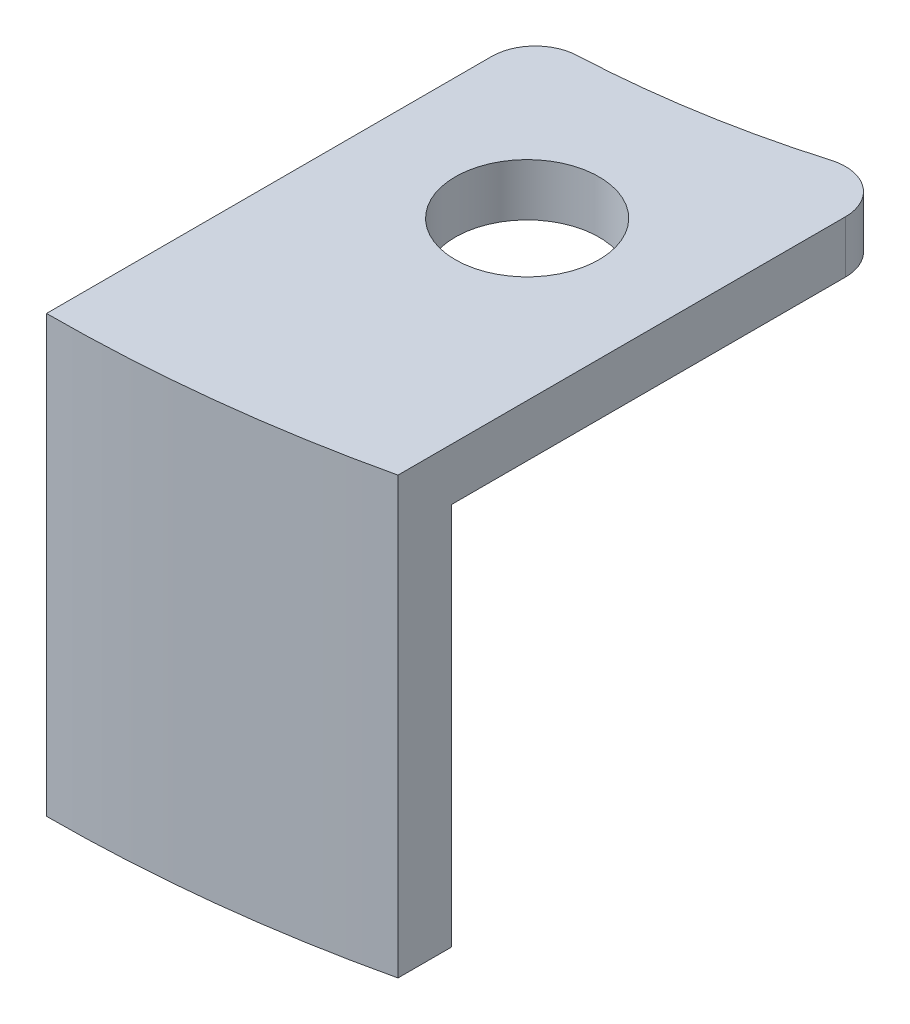
ISO-10303-21;
HEADER;
FILE_DESCRIPTION(('STEP AP214'),'2;1');
FILE_NAME('part.step','',(''),(''),'','','');
FILE_SCHEMA(('AUTOMOTIVE_DESIGN { 1 0 10303 214 1 1 1 1 }'));
ENDSEC;
DATA;
#1=APPLICATION_CONTEXT('core data for automotive mechanical design processes');
#2=APPLICATION_PROTOCOL_DEFINITION('international standard','automotive_design',2000,#1);
#3=PRODUCT_CONTEXT('',#1,'mechanical');
#4=PRODUCT('Part','Part','',(#3));
#5=PRODUCT_RELATED_PRODUCT_CATEGORY('part','',(#4));
#6=PRODUCT_DEFINITION_FORMATION('','',#4);
#7=PRODUCT_DEFINITION_CONTEXT('part definition',#1,'design');
#8=PRODUCT_DEFINITION('design','',#6,#7);
#9=PRODUCT_DEFINITION_SHAPE('','',#8);
#10=(LENGTH_UNIT() NAMED_UNIT(*) SI_UNIT(.MILLI.,.METRE.));
#11=(NAMED_UNIT(*) PLANE_ANGLE_UNIT() SI_UNIT($,.RADIAN.));
#12=(NAMED_UNIT(*) SI_UNIT($,.STERADIAN.) SOLID_ANGLE_UNIT());
#13=UNCERTAINTY_MEASURE_WITH_UNIT(LENGTH_MEASURE(1.E-05),#10,'distance_accuracy_value','');
#14=(GEOMETRIC_REPRESENTATION_CONTEXT(3) GLOBAL_UNCERTAINTY_ASSIGNED_CONTEXT((#13)) GLOBAL_UNIT_ASSIGNED_CONTEXT((#10,
#11,#12)) REPRESENTATION_CONTEXT('',''));
#15=CARTESIAN_POINT('',(0.,0.,0.));
#16=DIRECTION('',(0.,0.,1.));
#17=DIRECTION('',(1.,0.,0.));
#18=AXIS2_PLACEMENT_3D('',#15,#16,#17);
#19=CARTESIAN_POINT('',(0.,-2.4,-42.5));
#20=DIRECTION('',(0.,1.,0.));
#21=DIRECTION('',(0.,0.,1.));
#22=AXIS2_PLACEMENT_3D('',#19,#20,#21);
#23=CYLINDRICAL_SURFACE('',#22,42.5);
#24=CARTESIAN_POINT('',(0.,-2.4,-42.5));
#25=DIRECTION('',(0.,-1.,0.));
#26=DIRECTION('',(0.,0.,1.));
#27=AXIS2_PLACEMENT_3D('',#24,#25,#26);
#28=CIRCLE('',#27,42.5);
#29=CARTESIAN_POINT('',(11.938202247191,-2.4,-1.71116173381296));
#30=VERTEX_POINT('',#29);
#31=CARTESIAN_POINT('',(1.91011235955056,-2.4,-0.0429455711551743));
#32=VERTEX_POINT('',#31);
#33=EDGE_CURVE('E145',#30,#32,#28,.T.);
#34=ORIENTED_EDGE('',*,*,#33,.T.);
#35=DIRECTION('',(0.,1.,0.));
#36=VECTOR('',#35,1.);
#37=CARTESIAN_POINT('',(1.91011235955056,-2.4,-0.0429455711551674));
#38=LINE('',#37,#36);
#39=CARTESIAN_POINT('',(1.91011235955056,0.,-0.0429455711551743));
#40=VERTEX_POINT('',#39);
#41=EDGE_CURVE('E162',#32,#40,#38,.T.);
#42=ORIENTED_EDGE('',*,*,#41,.T.);
#43=CARTESIAN_POINT('',(0.,0.,-42.5));
#44=DIRECTION('',(0.,-1.,0.));
#45=DIRECTION('',(0.,0.,1.));
#46=AXIS2_PLACEMENT_3D('',#43,#44,#45);
#47=CIRCLE('',#46,42.5);
#48=CARTESIAN_POINT('',(11.938202247191,0.,-1.71116173381296));
#49=VERTEX_POINT('',#48);
#50=EDGE_CURVE('E140',#49,#40,#47,.T.);
#51=ORIENTED_EDGE('',*,*,#50,.F.);
#52=DIRECTION('',(0.,1.,0.));
#53=VECTOR('',#52,1.);
#54=CARTESIAN_POINT('',(11.938202247191,-2.4,-1.71116173381296));
#55=LINE('',#54,#53);
#56=EDGE_CURVE('E154',#49,#30,#55,.F.);
#57=ORIENTED_EDGE('',*,*,#56,.T.);
#58=EDGE_LOOP('',(#34,#42,#51,#57));
#59=FACE_BOUND('',#58,.T.);
#60=ADVANCED_FACE('F37',(#59),#23,.F.);
#61=CARTESIAN_POINT('',(14.5,-2.4,-2.55003128912364));
#62=DIRECTION('',(1.,0.,0.));
#63=DIRECTION('',(0.,0.,-1.));
#64=AXIS2_PLACEMENT_3D('',#61,#62,#63);
#65=PLANE('',#64);
#66=DIRECTION('',(0.,0.,-1.));
#67=VECTOR('',#66,1.);
#68=CARTESIAN_POINT('',(14.5,-2.4,-2.55003128912364));
#69=LINE('',#68,#67);
#70=CARTESIAN_POINT('',(14.5,-2.4,18.2947366142827));
#71=VERTEX_POINT('',#70);
#72=CARTESIAN_POINT('',(14.5,-2.4,0.208313008125252));
#73=VERTEX_POINT('',#72);
#74=EDGE_CURVE('E152',#71,#73,#69,.T.);
#75=ORIENTED_EDGE('',*,*,#74,.T.);
#76=DIRECTION('',(0.,1.,0.));
#77=VECTOR('',#76,1.);
#78=CARTESIAN_POINT('',(14.5,-2.4,0.208313008125252));
#79=LINE('',#78,#77);
#80=CARTESIAN_POINT('',(14.5,0.,0.208313008125252));
#81=VERTEX_POINT('',#80);
#82=EDGE_CURVE('E11',#73,#81,#79,.T.);
#83=ORIENTED_EDGE('',*,*,#82,.T.);
#84=DIRECTION('',(0.,0.,-1.));
#85=VECTOR('',#84,1.);
#86=CARTESIAN_POINT('',(14.5,0.,-2.55003128912364));
#87=LINE('',#86,#85);
#88=CARTESIAN_POINT('',(14.5,0.,20.7594656948666));
#89=VERTEX_POINT('',#88);
#90=EDGE_CURVE('E148',#89,#81,#87,.T.);
#91=ORIENTED_EDGE('',*,*,#90,.F.);
#92=DIRECTION('',(0.,1.,0.));
#93=VECTOR('',#92,1.);
#94=CARTESIAN_POINT('',(14.5,-20.,20.7594656948666));
#95=LINE('',#94,#93);
#96=CARTESIAN_POINT('',(14.5,-20.,20.7594656948666));
#97=VERTEX_POINT('',#96);
#98=EDGE_CURVE('E141',#97,#89,#95,.T.);
#99=ORIENTED_EDGE('',*,*,#98,.F.);
#100=DIRECTION('',(0.,0.,-1.));
#101=VECTOR('',#100,1.);
#102=CARTESIAN_POINT('',(14.5,-20.,18.2947366142827));
#103=LINE('',#102,#101);
#104=CARTESIAN_POINT('',(14.5,-20.,18.2947366142827));
#105=VERTEX_POINT('',#104);
#106=EDGE_CURVE('E114',#97,#105,#103,.T.);
#107=ORIENTED_EDGE('',*,*,#106,.T.);
#108=DIRECTION('',(0.,1.,0.));
#109=VECTOR('',#108,1.);
#110=CARTESIAN_POINT('',(14.5,-20.,18.2947366142827));
#111=LINE('',#110,#109);
#112=EDGE_CURVE('E128',#105,#71,#111,.T.);
#113=ORIENTED_EDGE('',*,*,#112,.T.);
#114=EDGE_LOOP('',(#75,#83,#91,#99,#107,#113));
#115=FACE_BOUND('',#114,.T.);
#116=ADVANCED_FACE('F184',(#115),#65,.T.);
#117=CARTESIAN_POINT('',(0.,-2.4,0.));
#118=DIRECTION('',(-1.,0.,0.));
#119=DIRECTION('',(0.,0.,1.));
#120=AXIS2_PLACEMENT_3D('',#117,#118,#119);
#121=PLANE('',#120);
#122=DIRECTION('',(0.,0.,1.));
#123=VECTOR('',#122,1.);
#124=CARTESIAN_POINT('',(0.,0.,0.));
#125=LINE('',#124,#123);
#126=CARTESIAN_POINT('',(0.,0.,1.95503346079047));
#127=VERTEX_POINT('',#126);
#128=CARTESIAN_POINT('',(0.,0.,22.4));
#129=VERTEX_POINT('',#128);
#130=EDGE_CURVE('E157',#127,#129,#125,.T.);
#131=ORIENTED_EDGE('',*,*,#130,.F.);
#132=DIRECTION('',(0.,1.,0.));
#133=VECTOR('',#132,1.);
#134=CARTESIAN_POINT('',(0.,-2.4,1.95503346079047));
#135=LINE('',#134,#133);
#136=CARTESIAN_POINT('',(0.,-2.4,1.95503346079047));
#137=VERTEX_POINT('',#136);
#138=EDGE_CURVE('E60',#127,#137,#135,.F.);
#139=ORIENTED_EDGE('',*,*,#138,.T.);
#140=DIRECTION('',(0.,0.,1.));
#141=VECTOR('',#140,1.);
#142=CARTESIAN_POINT('',(0.,-2.4,0.));
#143=LINE('',#142,#141);
#144=CARTESIAN_POINT('',(0.,-2.4,20.));
#145=VERTEX_POINT('',#144);
#146=EDGE_CURVE('E109',#137,#145,#143,.T.);
#147=ORIENTED_EDGE('',*,*,#146,.T.);
#148=DIRECTION('',(0.,1.,0.));
#149=VECTOR('',#148,1.);
#150=CARTESIAN_POINT('',(0.,-20.,20.));
#151=LINE('',#150,#149);
#152=CARTESIAN_POINT('',(0.,-20.,20.));
#153=VERTEX_POINT('',#152);
#154=EDGE_CURVE('E104',#153,#145,#151,.T.);
#155=ORIENTED_EDGE('',*,*,#154,.F.);
#156=DIRECTION('',(0.,0.,1.));
#157=VECTOR('',#156,1.);
#158=CARTESIAN_POINT('',(0.,-20.,20.));
#159=LINE('',#158,#157);
#160=CARTESIAN_POINT('',(0.,-20.,22.4));
#161=VERTEX_POINT('',#160);
#162=EDGE_CURVE('E108',#153,#161,#159,.T.);
#163=ORIENTED_EDGE('',*,*,#162,.T.);
#164=DIRECTION('',(0.,1.,0.));
#165=VECTOR('',#164,1.);
#166=CARTESIAN_POINT('',(0.,-20.,22.4));
#167=LINE('',#166,#165);
#168=EDGE_CURVE('E113',#161,#129,#167,.T.);
#169=ORIENTED_EDGE('',*,*,#168,.T.);
#170=EDGE_LOOP('',(#131,#139,#147,#155,#163,#169));
#171=FACE_BOUND('',#170,.T.);
#172=ADVANCED_FACE('F106',(#171),#121,.T.);
#173=CARTESIAN_POINT('',(0.,-2.4,-42.5));
#174=DIRECTION('',(0.,1.,0.));
#175=DIRECTION('',(0.,0.,1.));
#176=AXIS2_PLACEMENT_3D('',#173,#174,#175);
#177=PLANE('',#176);
#178=CARTESIAN_POINT('',(7.25,-2.4,7.57807584002584));
#179=DIRECTION('',(0.,1.,0.));
#180=DIRECTION('',(0.,0.,1.));
#181=AXIS2_PLACEMENT_3D('',#178,#179,#180);
#182=CIRCLE('',#181,3.3);
#183=CARTESIAN_POINT('',(7.25,-2.4,10.8780758400258));
#184=VERTEX_POINT('',#183);
#185=EDGE_CURVE('E132',#184,#184,#182,.T.);
#186=ORIENTED_EDGE('',*,*,#185,.T.);
#187=EDGE_LOOP('',(#186));
#188=FACE_BOUND('',#187,.T.);
#189=ORIENTED_EDGE('',*,*,#146,.F.);
#190=CARTESIAN_POINT('',(2.,-2.4,1.95503346079047));
#191=DIRECTION('',(0.,1.,0.));
#192=DIRECTION('',(0.,0.,1.));
#193=AXIS2_PLACEMENT_3D('',#190,#191,#192);
#194=CIRCLE('',#193,2.);
#195=EDGE_CURVE('E45',#137,#32,#194,.F.);
#196=ORIENTED_EDGE('',*,*,#195,.T.);
#197=ORIENTED_EDGE('',*,*,#33,.F.);
#198=CARTESIAN_POINT('',(12.5,-2.4,0.208313008125252));
#199=DIRECTION('',(0.,1.,0.));
#200=DIRECTION('',(0.,0.,1.));
#201=AXIS2_PLACEMENT_3D('',#198,#199,#200);
#202=CIRCLE('',#201,2.);
#203=EDGE_CURVE('E52',#30,#73,#202,.F.);
#204=ORIENTED_EDGE('',*,*,#203,.T.);
#205=ORIENTED_EDGE('',*,*,#74,.F.);
#206=CARTESIAN_POINT('',(0.,-2.4,-42.5));
#207=DIRECTION('',(0.,1.,0.));
#208=DIRECTION('',(0.,0.,1.));
#209=AXIS2_PLACEMENT_3D('',#206,#207,#208);
#210=CIRCLE('',#209,62.5);
#211=EDGE_CURVE('E150',#145,#71,#210,.T.);
#212=ORIENTED_EDGE('',*,*,#211,.F.);
#213=EDGE_LOOP('',(#189,#196,#197,#204,#205,#212));
#214=FACE_BOUND('',#213,.T.);
#215=ADVANCED_FACE('F171',(#188,#214),#177,.F.);
#216=CARTESIAN_POINT('',(0.,0.,-42.5));
#217=DIRECTION('',(0.,1.,0.));
#218=DIRECTION('',(0.,0.,1.));
#219=AXIS2_PLACEMENT_3D('',#216,#217,#218);
#220=PLANE('',#219);
#221=CARTESIAN_POINT('',(7.25,0.,7.57807584002584));
#222=DIRECTION('',(0.,1.,0.));
#223=DIRECTION('',(0.,0.,1.));
#224=AXIS2_PLACEMENT_3D('',#221,#222,#223);
#225=CIRCLE('',#224,3.3);
#226=CARTESIAN_POINT('',(7.25,0.,10.8780758400258));
#227=VERTEX_POINT('',#226);
#228=EDGE_CURVE('E311',#227,#227,#225,.T.);
#229=ORIENTED_EDGE('',*,*,#228,.F.);
#230=EDGE_LOOP('',(#229));
#231=FACE_BOUND('',#230,.T.);
#232=ORIENTED_EDGE('',*,*,#50,.T.);
#233=CARTESIAN_POINT('',(2.,0.,1.95503346079047));
#234=DIRECTION('',(0.,1.,0.));
#235=DIRECTION('',(0.,0.,1.));
#236=AXIS2_PLACEMENT_3D('',#233,#234,#235);
#237=CIRCLE('',#236,2.);
#238=EDGE_CURVE('E167',#40,#127,#237,.T.);
#239=ORIENTED_EDGE('',*,*,#238,.T.);
#240=ORIENTED_EDGE('',*,*,#130,.T.);
#241=CARTESIAN_POINT('',(0.,0.,-42.5));
#242=DIRECTION('',(0.,1.,0.));
#243=DIRECTION('',(0.,0.,1.));
#244=AXIS2_PLACEMENT_3D('',#241,#242,#243);
#245=CIRCLE('',#244,64.9);
#246=EDGE_CURVE('E129',#129,#89,#245,.T.);
#247=ORIENTED_EDGE('',*,*,#246,.T.);
#248=ORIENTED_EDGE('',*,*,#90,.T.);
#249=CARTESIAN_POINT('',(12.5,0.,0.208313008125252));
#250=DIRECTION('',(0.,1.,0.));
#251=DIRECTION('',(0.,0.,1.));
#252=AXIS2_PLACEMENT_3D('',#249,#250,#251);
#253=CIRCLE('',#252,2.);
#254=EDGE_CURVE('E165',#81,#49,#253,.T.);
#255=ORIENTED_EDGE('',*,*,#254,.T.);
#256=EDGE_LOOP('',(#232,#239,#240,#247,#248,#255));
#257=FACE_BOUND('',#256,.T.);
#258=ADVANCED_FACE('F179',(#231,#257),#220,.T.);
#259=CARTESIAN_POINT('',(0.,-20.,-42.5));
#260=DIRECTION('',(0.,1.,0.));
#261=DIRECTION('',(0.,0.,1.));
#262=AXIS2_PLACEMENT_3D('',#259,#260,#261);
#263=CYLINDRICAL_SURFACE('',#262,62.5);
#264=ORIENTED_EDGE('',*,*,#211,.T.);
#265=ORIENTED_EDGE('',*,*,#112,.F.);
#266=CARTESIAN_POINT('',(0.,-20.,-42.5));
#267=DIRECTION('',(0.,-1.,0.));
#268=DIRECTION('',(0.,0.,1.));
#269=AXIS2_PLACEMENT_3D('',#266,#267,#268);
#270=CIRCLE('',#269,62.5);
#271=EDGE_CURVE('E121',#105,#153,#270,.T.);
#272=ORIENTED_EDGE('',*,*,#271,.T.);
#273=ORIENTED_EDGE('',*,*,#154,.T.);
#274=EDGE_LOOP('',(#264,#265,#272,#273));
#275=FACE_BOUND('',#274,.T.);
#276=ADVANCED_FACE('F126',(#275),#263,.F.);
#277=CARTESIAN_POINT('',(0.,-20.,-42.5));
#278=DIRECTION('',(0.,1.,0.));
#279=DIRECTION('',(0.,0.,1.));
#280=AXIS2_PLACEMENT_3D('',#277,#278,#279);
#281=CYLINDRICAL_SURFACE('',#280,64.9);
#282=ORIENTED_EDGE('',*,*,#246,.F.);
#283=ORIENTED_EDGE('',*,*,#168,.F.);
#284=CARTESIAN_POINT('',(0.,-20.,-42.5));
#285=DIRECTION('',(0.,1.,0.));
#286=DIRECTION('',(0.,0.,1.));
#287=AXIS2_PLACEMENT_3D('',#284,#285,#286);
#288=CIRCLE('',#287,64.9);
#289=EDGE_CURVE('E124',#161,#97,#288,.T.);
#290=ORIENTED_EDGE('',*,*,#289,.T.);
#291=ORIENTED_EDGE('',*,*,#98,.T.);
#292=EDGE_LOOP('',(#282,#283,#290,#291));
#293=FACE_BOUND('',#292,.T.);
#294=ADVANCED_FACE('F182',(#293),#281,.T.);
#295=CARTESIAN_POINT('',(0.,-20.,-42.5));
#296=DIRECTION('',(0.,1.,0.));
#297=DIRECTION('',(0.,0.,1.));
#298=AXIS2_PLACEMENT_3D('',#295,#296,#297);
#299=PLANE('',#298);
#300=ORIENTED_EDGE('',*,*,#271,.F.);
#301=ORIENTED_EDGE('',*,*,#106,.F.);
#302=ORIENTED_EDGE('',*,*,#289,.F.);
#303=ORIENTED_EDGE('',*,*,#162,.F.);
#304=EDGE_LOOP('',(#300,#301,#302,#303));
#305=FACE_BOUND('',#304,.T.);
#306=ADVANCED_FACE('F119',(#305),#299,.F.);
#307=CARTESIAN_POINT('',(2.,-2.4,1.95503346079047));
#308=DIRECTION('',(0.,1.,0.));
#309=DIRECTION('',(0.,0.,1.));
#310=AXIS2_PLACEMENT_3D('',#307,#308,#309);
#311=CYLINDRICAL_SURFACE('',#310,2.);
#312=ORIENTED_EDGE('',*,*,#195,.F.);
#313=ORIENTED_EDGE('',*,*,#138,.F.);
#314=ORIENTED_EDGE('',*,*,#238,.F.);
#315=ORIENTED_EDGE('',*,*,#41,.F.);
#316=EDGE_LOOP('',(#312,#313,#314,#315));
#317=FACE_BOUND('',#316,.T.);
#318=ADVANCED_FACE('F177',(#317),#311,.T.);
#319=CARTESIAN_POINT('',(12.5,-2.4,0.208313008125252));
#320=DIRECTION('',(0.,1.,0.));
#321=DIRECTION('',(0.,0.,1.));
#322=AXIS2_PLACEMENT_3D('',#319,#320,#321);
#323=CYLINDRICAL_SURFACE('',#322,2.);
#324=ORIENTED_EDGE('',*,*,#203,.F.);
#325=ORIENTED_EDGE('',*,*,#56,.F.);
#326=ORIENTED_EDGE('',*,*,#254,.F.);
#327=ORIENTED_EDGE('',*,*,#82,.F.);
#328=EDGE_LOOP('',(#324,#325,#326,#327));
#329=FACE_BOUND('',#328,.T.);
#330=ADVANCED_FACE('F39',(#329),#323,.T.);
#331=CARTESIAN_POINT('',(7.25,-20.,7.57807584002584));
#332=DIRECTION('',(0.,1.,0.));
#333=DIRECTION('',(0.,0.,1.));
#334=AXIS2_PLACEMENT_3D('',#331,#332,#333);
#335=CYLINDRICAL_SURFACE('',#334,3.3);
#336=ORIENTED_EDGE('',*,*,#228,.T.);
#337=EDGE_LOOP('',(#336));
#338=FACE_BOUND('',#337,.T.);
#339=ORIENTED_EDGE('',*,*,#185,.F.);
#340=EDGE_LOOP('',(#339));
#341=FACE_BOUND('',#340,.T.);
#342=ADVANCED_FACE('F188',(#338,#341),#335,.F.);
#343=CLOSED_SHELL('',(#60,#116,#172,#215,#258,#276,#294,#306,#318,#330,#342));
#344=MANIFOLD_SOLID_BREP('B2',#343);
#345=ADVANCED_BREP_SHAPE_REPRESENTATION('',(#18,#344),#14);
#346=SHAPE_DEFINITION_REPRESENTATION(#9,#345);
ENDSEC;
END-ISO-10303-21;
